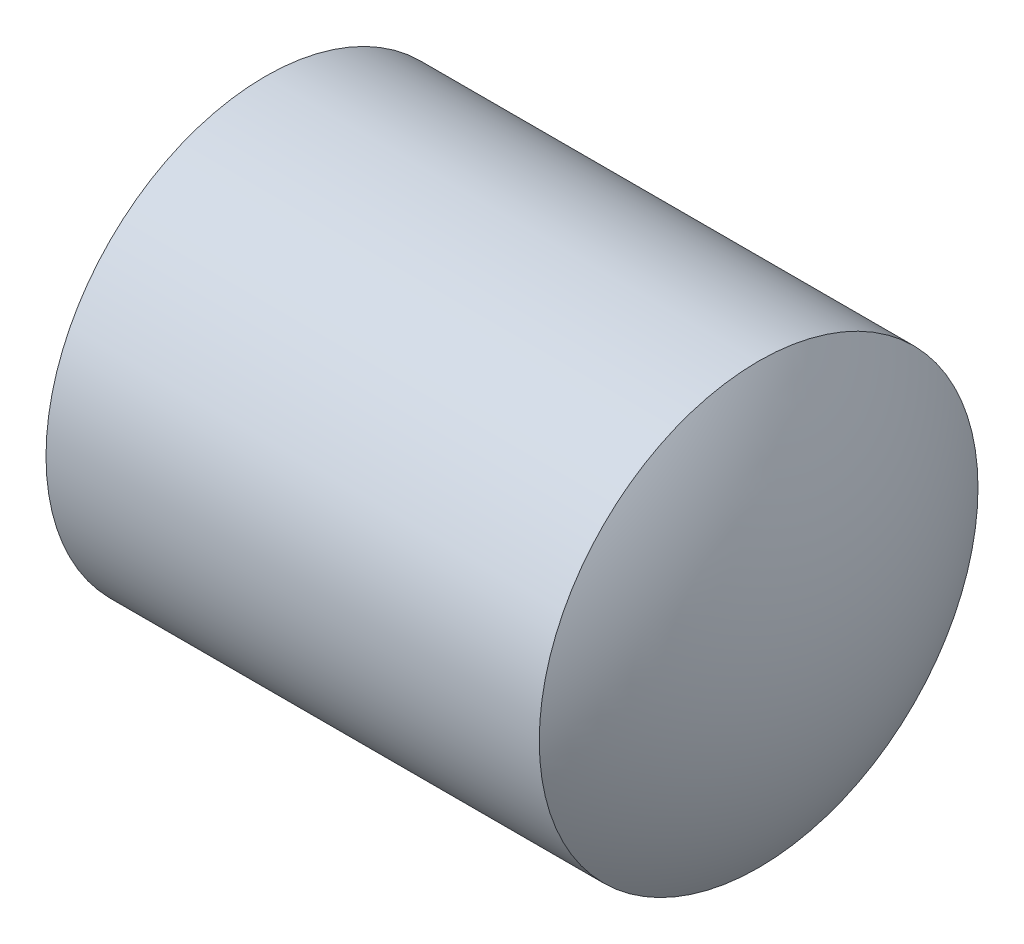
ISO-10303-21;
HEADER;
FILE_DESCRIPTION(('STEP AP214'),'2;1');
FILE_NAME('part.step','',(''),(''),'','','');
FILE_SCHEMA(('AUTOMOTIVE_DESIGN { 1 0 10303 214 1 1 1 1 }'));
ENDSEC;
DATA;
#1=APPLICATION_CONTEXT('core data for automotive mechanical design processes');
#2=APPLICATION_PROTOCOL_DEFINITION('international standard','automotive_design',2000,#1);
#3=PRODUCT_CONTEXT('',#1,'mechanical');
#4=PRODUCT('Part','Part','',(#3));
#5=PRODUCT_RELATED_PRODUCT_CATEGORY('part','',(#4));
#6=PRODUCT_DEFINITION_FORMATION('','',#4);
#7=PRODUCT_DEFINITION_CONTEXT('part definition',#1,'design');
#8=PRODUCT_DEFINITION('design','',#6,#7);
#9=PRODUCT_DEFINITION_SHAPE('','',#8);
#10=(LENGTH_UNIT() NAMED_UNIT(*) SI_UNIT(.MILLI.,.METRE.));
#11=(NAMED_UNIT(*) PLANE_ANGLE_UNIT() SI_UNIT($,.RADIAN.));
#12=(NAMED_UNIT(*) SI_UNIT($,.STERADIAN.) SOLID_ANGLE_UNIT());
#13=UNCERTAINTY_MEASURE_WITH_UNIT(LENGTH_MEASURE(1.E-05),#10,'distance_accuracy_value','');
#14=(GEOMETRIC_REPRESENTATION_CONTEXT(3) GLOBAL_UNCERTAINTY_ASSIGNED_CONTEXT((#13)) GLOBAL_UNIT_ASSIGNED_CONTEXT((#10,
#11,#12)) REPRESENTATION_CONTEXT('',''));
#15=CARTESIAN_POINT('',(0.,0.,0.));
#16=DIRECTION('',(0.,0.,1.));
#17=DIRECTION('',(1.,0.,0.));
#18=AXIS2_PLACEMENT_3D('',#15,#16,#17);
#19=CARTESIAN_POINT('',(0.,0.,0.));
#20=DIRECTION('',(-1.,0.,0.));
#21=DIRECTION('',(0.,0.,1.));
#22=AXIS2_PLACEMENT_3D('',#19,#20,#21);
#23=PLANE('',#22);
#24=CARTESIAN_POINT('',(0.,0.,0.));
#25=DIRECTION('',(-1.,0.,0.));
#26=DIRECTION('',(0.,0.,1.));
#27=AXIS2_PLACEMENT_3D('',#24,#25,#26);
#28=CIRCLE('',#27,1.2195);
#29=CARTESIAN_POINT('',(0.,0.,1.2195));
#30=VERTEX_POINT('',#29);
#31=EDGE_CURVE('E137',#30,#30,#28,.T.);
#32=ORIENTED_EDGE('',*,*,#31,.T.);
#33=EDGE_LOOP('',(#32));
#34=FACE_BOUND('',#33,.T.);
#35=DIRECTION('',(0.,0.,-1.));
#36=VECTOR('',#35,1.);
#37=CARTESIAN_POINT('',(0.,0.750000000000005,0.43301270189222));
#38=LINE('',#37,#36);
#39=CARTESIAN_POINT('',(0.,0.750000000000005,0.43301270189222));
#40=VERTEX_POINT('',#39);
#41=CARTESIAN_POINT('',(0.,0.750000000000005,-0.433012701892219));
#42=VERTEX_POINT('',#41);
#43=EDGE_CURVE('E128',#40,#42,#38,.T.);
#44=ORIENTED_EDGE('',*,*,#43,.F.);
#45=DIRECTION('',(0.,-0.866025403784438,0.5));
#46=VECTOR('',#45,1.);
#47=CARTESIAN_POINT('',(0.,0.750000000000005,0.43301270189222));
#48=LINE('',#47,#46);
#49=CARTESIAN_POINT('',(0.,0.,0.866025403784439));
#50=VERTEX_POINT('',#49);
#51=EDGE_CURVE('E50',#40,#50,#48,.T.);
#52=ORIENTED_EDGE('',*,*,#51,.T.);
#53=DIRECTION('',(0.,0.866025403784439,0.5));
#54=VECTOR('',#53,1.);
#55=CARTESIAN_POINT('',(0.,-0.749999999999995,0.43301270189222));
#56=LINE('',#55,#54);
#57=CARTESIAN_POINT('',(0.,-0.749999999999995,0.43301270189222));
#58=VERTEX_POINT('',#57);
#59=EDGE_CURVE('E119',#58,#50,#56,.T.);
#60=ORIENTED_EDGE('',*,*,#59,.F.);
#61=DIRECTION('',(0.,0.,-1.));
#62=VECTOR('',#61,1.);
#63=CARTESIAN_POINT('',(0.,-0.749999999999995,0.43301270189222));
#64=LINE('',#63,#62);
#65=CARTESIAN_POINT('',(0.,-0.749999999999995,-0.433012701892219));
#66=VERTEX_POINT('',#65);
#67=EDGE_CURVE('E122',#58,#66,#64,.T.);
#68=ORIENTED_EDGE('',*,*,#67,.T.);
#69=DIRECTION('',(0.,0.866025403784438,-0.500000000000001));
#70=VECTOR('',#69,1.);
#71=CARTESIAN_POINT('',(0.,-0.749999999999995,-0.433012701892219));
#72=LINE('',#71,#70);
#73=CARTESIAN_POINT('',(0.,0.,-0.866025403784438));
#74=VERTEX_POINT('',#73);
#75=EDGE_CURVE('E125',#66,#74,#72,.T.);
#76=ORIENTED_EDGE('',*,*,#75,.T.);
#77=DIRECTION('',(0.,-0.866025403784439,-0.5));
#78=VECTOR('',#77,1.);
#79=CARTESIAN_POINT('',(0.,0.750000000000005,-0.433012701892219));
#80=LINE('',#79,#78);
#81=EDGE_CURVE('E108',#42,#74,#80,.T.);
#82=ORIENTED_EDGE('',*,*,#81,.F.);
#83=EDGE_LOOP('',(#44,#52,#60,#68,#76,#82));
#84=FACE_BOUND('',#83,.T.);
#85=ADVANCED_FACE('F35',(#34,#84),#23,.T.);
#86=CARTESIAN_POINT('',(1.35,0.,0.));
#87=DIRECTION('',(-1.,0.,0.));
#88=DIRECTION('',(0.,1.,0.));
#89=AXIS2_PLACEMENT_3D('',#86,#87,#88);
#90=SPHERICAL_SURFACE('',#89,2.65);
#91=CARTESIAN_POINT('',(3.53460522749535,0.,0.));
#92=DIRECTION('',(-1.,0.,0.));
#93=DIRECTION('',(0.,0.,1.));
#94=AXIS2_PLACEMENT_3D('',#91,#92,#93);
#95=CIRCLE('',#94,1.5);
#96=CARTESIAN_POINT('',(3.53460522749535,0.,1.5));
#97=VERTEX_POINT('',#96);
#98=EDGE_CURVE('E11',#97,#97,#95,.T.);
#99=ORIENTED_EDGE('',*,*,#98,.F.);
#100=EDGE_LOOP('',(#99));
#101=FACE_BOUND('',#100,.T.);
#102=ADVANCED_FACE('F37',(#101),#90,.T.);
#103=CARTESIAN_POINT('',(-12.7,0.,0.));
#104=DIRECTION('',(-1.,0.,0.));
#105=DIRECTION('',(0.,0.,1.));
#106=AXIS2_PLACEMENT_3D('',#103,#104,#105);
#107=CYLINDRICAL_SURFACE('',#106,1.5);
#108=ORIENTED_EDGE('',*,*,#98,.T.);
#109=EDGE_LOOP('',(#108));
#110=FACE_BOUND('',#109,.T.);
#111=CARTESIAN_POINT('',(0.161946750507689,0.,0.));
#112=DIRECTION('',(-1.,0.,0.));
#113=DIRECTION('',(0.,0.,1.));
#114=AXIS2_PLACEMENT_3D('',#111,#112,#113);
#115=CIRCLE('',#114,1.5);
#116=CARTESIAN_POINT('',(0.161946750507689,0.,1.5));
#117=VERTEX_POINT('',#116);
#118=EDGE_CURVE('E43',#117,#117,#115,.T.);
#119=ORIENTED_EDGE('',*,*,#118,.F.);
#120=EDGE_LOOP('',(#119));
#121=FACE_BOUND('',#120,.T.);
#122=ADVANCED_FACE('F145',(#110,#121),#107,.T.);
#123=CARTESIAN_POINT('',(0.,0.,0.));
#124=DIRECTION('',(1.,0.,0.));
#125=DIRECTION('',(0.,0.,-1.));
#126=AXIS2_PLACEMENT_3D('',#123,#124,#125);
#127=CONICAL_SURFACE('',#126,1.2195,1.0471975511966);
#128=ORIENTED_EDGE('',*,*,#118,.T.);
#129=EDGE_LOOP('',(#128));
#130=FACE_BOUND('',#129,.T.);
#131=ORIENTED_EDGE('',*,*,#31,.F.);
#132=EDGE_LOOP('',(#131));
#133=FACE_BOUND('',#132,.T.);
#134=ADVANCED_FACE('F142',(#130,#133),#127,.T.);
#135=CARTESIAN_POINT('',(1.5,0.750000000000005,0.43301270189222));
#136=DIRECTION('',(0.,-0.500000000000001,-0.866025403784438));
#137=DIRECTION('',(0.,0.866025403784438,-0.500000000000001));
#138=AXIS2_PLACEMENT_3D('',#135,#136,#137);
#139=PLANE('',#138);
#140=ORIENTED_EDGE('',*,*,#51,.F.);
#141=DIRECTION('',(-1.,0.,0.));
#142=VECTOR('',#141,1.);
#143=CARTESIAN_POINT('',(1.5,0.750000000000005,0.43301270189222));
#144=LINE('',#143,#142);
#145=CARTESIAN_POINT('',(1.5,0.750000000000005,0.43301270189222));
#146=VERTEX_POINT('',#145);
#147=EDGE_CURVE('E55',#146,#40,#144,.T.);
#148=ORIENTED_EDGE('',*,*,#147,.F.);
#149=DIRECTION('',(0.,-0.866025403784438,0.5));
#150=VECTOR('',#149,1.);
#151=CARTESIAN_POINT('',(1.5,0.750000000000005,0.43301270189222));
#152=LINE('',#151,#150);
#153=CARTESIAN_POINT('',(1.5,0.,0.866025403784439));
#154=VERTEX_POINT('',#153);
#155=EDGE_CURVE('E82',#146,#154,#152,.T.);
#156=ORIENTED_EDGE('',*,*,#155,.T.);
#157=DIRECTION('',(-1.,0.,0.));
#158=VECTOR('',#157,1.);
#159=CARTESIAN_POINT('',(1.5,0.,0.866025403784439));
#160=LINE('',#159,#158);
#161=EDGE_CURVE('E135',#154,#50,#160,.T.);
#162=ORIENTED_EDGE('',*,*,#161,.T.);
#163=EDGE_LOOP('',(#140,#148,#156,#162));
#164=FACE_BOUND('',#163,.T.);
#165=ADVANCED_FACE('F152',(#164),#139,.T.);
#166=CARTESIAN_POINT('',(1.5,-0.749999999999995,0.43301270189222));
#167=DIRECTION('',(0.,-0.5,0.866025403784439));
#168=DIRECTION('',(0.,-0.866025403784439,-0.5));
#169=AXIS2_PLACEMENT_3D('',#166,#167,#168);
#170=PLANE('',#169);
#171=ORIENTED_EDGE('',*,*,#59,.T.);
#172=ORIENTED_EDGE('',*,*,#161,.F.);
#173=DIRECTION('',(0.,0.866025403784439,0.5));
#174=VECTOR('',#173,1.);
#175=CARTESIAN_POINT('',(1.5,-0.749999999999995,0.43301270189222));
#176=LINE('',#175,#174);
#177=CARTESIAN_POINT('',(1.5,-0.749999999999995,0.43301270189222));
#178=VERTEX_POINT('',#177);
#179=EDGE_CURVE('E250',#178,#154,#176,.T.);
#180=ORIENTED_EDGE('',*,*,#179,.F.);
#181=DIRECTION('',(-1.,0.,0.));
#182=VECTOR('',#181,1.);
#183=CARTESIAN_POINT('',(1.5,-0.749999999999995,0.43301270189222));
#184=LINE('',#183,#182);
#185=EDGE_CURVE('E133',#178,#58,#184,.T.);
#186=ORIENTED_EDGE('',*,*,#185,.T.);
#187=EDGE_LOOP('',(#171,#172,#180,#186));
#188=FACE_BOUND('',#187,.T.);
#189=ADVANCED_FACE('F164',(#188),#170,.F.);
#190=CARTESIAN_POINT('',(1.5,-0.749999999999995,0.43301270189222));
#191=DIRECTION('',(0.,1.,0.));
#192=DIRECTION('',(0.,0.,1.));
#193=AXIS2_PLACEMENT_3D('',#190,#191,#192);
#194=PLANE('',#193);
#195=ORIENTED_EDGE('',*,*,#67,.F.);
#196=ORIENTED_EDGE('',*,*,#185,.F.);
#197=DIRECTION('',(0.,0.,-1.));
#198=VECTOR('',#197,1.);
#199=CARTESIAN_POINT('',(1.5,-0.749999999999995,0.43301270189222));
#200=LINE('',#199,#198);
#201=CARTESIAN_POINT('',(1.5,-0.749999999999995,-0.433012701892219));
#202=VERTEX_POINT('',#201);
#203=EDGE_CURVE('E103',#178,#202,#200,.T.);
#204=ORIENTED_EDGE('',*,*,#203,.T.);
#205=DIRECTION('',(-1.,0.,0.));
#206=VECTOR('',#205,1.);
#207=CARTESIAN_POINT('',(1.5,-0.749999999999995,-0.433012701892219));
#208=LINE('',#207,#206);
#209=EDGE_CURVE('E98',#202,#66,#208,.T.);
#210=ORIENTED_EDGE('',*,*,#209,.T.);
#211=EDGE_LOOP('',(#195,#196,#204,#210));
#212=FACE_BOUND('',#211,.T.);
#213=ADVANCED_FACE('F167',(#212),#194,.T.);
#214=CARTESIAN_POINT('',(1.5,-0.749999999999995,-0.433012701892219));
#215=DIRECTION('',(0.,0.500000000000001,0.866025403784438));
#216=DIRECTION('',(0.,-0.866025403784438,0.500000000000001));
#217=AXIS2_PLACEMENT_3D('',#214,#215,#216);
#218=PLANE('',#217);
#219=ORIENTED_EDGE('',*,*,#75,.F.);
#220=ORIENTED_EDGE('',*,*,#209,.F.);
#221=DIRECTION('',(0.,0.866025403784438,-0.500000000000001));
#222=VECTOR('',#221,1.);
#223=CARTESIAN_POINT('',(1.5,-0.749999999999995,-0.433012701892219));
#224=LINE('',#223,#222);
#225=CARTESIAN_POINT('',(1.5,0.,-0.866025403784438));
#226=VERTEX_POINT('',#225);
#227=EDGE_CURVE('E93',#202,#226,#224,.T.);
#228=ORIENTED_EDGE('',*,*,#227,.T.);
#229=DIRECTION('',(-1.,0.,0.));
#230=VECTOR('',#229,1.);
#231=CARTESIAN_POINT('',(1.5,0.,-0.866025403784438));
#232=LINE('',#231,#230);
#233=EDGE_CURVE('E97',#226,#74,#232,.T.);
#234=ORIENTED_EDGE('',*,*,#233,.T.);
#235=EDGE_LOOP('',(#219,#220,#228,#234));
#236=FACE_BOUND('',#235,.T.);
#237=ADVANCED_FACE('F96',(#236),#218,.T.);
#238=CARTESIAN_POINT('',(1.5,0.750000000000005,-0.433012701892219));
#239=DIRECTION('',(0.,0.5,-0.866025403784438));
#240=DIRECTION('',(0.,0.866025403784439,0.5));
#241=AXIS2_PLACEMENT_3D('',#238,#239,#240);
#242=PLANE('',#241);
#243=ORIENTED_EDGE('',*,*,#81,.T.);
#244=ORIENTED_EDGE('',*,*,#233,.F.);
#245=DIRECTION('',(0.,-0.866025403784439,-0.5));
#246=VECTOR('',#245,1.);
#247=CARTESIAN_POINT('',(1.5,0.750000000000005,-0.433012701892219));
#248=LINE('',#247,#246);
#249=CARTESIAN_POINT('',(1.5,0.750000000000005,-0.433012701892219));
#250=VERTEX_POINT('',#249);
#251=EDGE_CURVE('E102',#250,#226,#248,.T.);
#252=ORIENTED_EDGE('',*,*,#251,.F.);
#253=DIRECTION('',(-1.,0.,0.));
#254=VECTOR('',#253,1.);
#255=CARTESIAN_POINT('',(1.5,0.750000000000005,-0.433012701892219));
#256=LINE('',#255,#254);
#257=EDGE_CURVE('E78',#250,#42,#256,.T.);
#258=ORIENTED_EDGE('',*,*,#257,.T.);
#259=EDGE_LOOP('',(#243,#244,#252,#258));
#260=FACE_BOUND('',#259,.T.);
#261=ADVANCED_FACE('F105',(#260),#242,.F.);
#262=CARTESIAN_POINT('',(1.5,0.750000000000005,0.43301270189222));
#263=DIRECTION('',(0.,1.,0.));
#264=DIRECTION('',(0.,0.,1.));
#265=AXIS2_PLACEMENT_3D('',#262,#263,#264);
#266=PLANE('',#265);
#267=ORIENTED_EDGE('',*,*,#43,.T.);
#268=ORIENTED_EDGE('',*,*,#257,.F.);
#269=DIRECTION('',(0.,0.,-1.));
#270=VECTOR('',#269,1.);
#271=CARTESIAN_POINT('',(1.5,0.750000000000005,0.43301270189222));
#272=LINE('',#271,#270);
#273=EDGE_CURVE('E113',#146,#250,#272,.T.);
#274=ORIENTED_EDGE('',*,*,#273,.F.);
#275=ORIENTED_EDGE('',*,*,#147,.T.);
#276=EDGE_LOOP('',(#267,#268,#274,#275));
#277=FACE_BOUND('',#276,.T.);
#278=ADVANCED_FACE('F176',(#277),#266,.F.);
#279=CARTESIAN_POINT('',(1.5,1.5,0.));
#280=DIRECTION('',(1.,0.,0.));
#281=DIRECTION('',(0.,0.,-1.));
#282=AXIS2_PLACEMENT_3D('',#279,#280,#281);
#283=PLANE('',#282);
#284=ORIENTED_EDGE('',*,*,#155,.F.);
#285=ORIENTED_EDGE('',*,*,#273,.T.);
#286=ORIENTED_EDGE('',*,*,#251,.T.);
#287=ORIENTED_EDGE('',*,*,#227,.F.);
#288=ORIENTED_EDGE('',*,*,#203,.F.);
#289=ORIENTED_EDGE('',*,*,#179,.T.);
#290=EDGE_LOOP('',(#284,#285,#286,#287,#288,#289));
#291=FACE_BOUND('',#290,.T.);
#292=ADVANCED_FACE('F111',(#291),#283,.F.);
#293=CLOSED_SHELL('',(#85,#102,#122,#134,#165,#189,#213,#237,#261,#278,#292));
#294=MANIFOLD_SOLID_BREP('B2',#293);
#295=ADVANCED_BREP_SHAPE_REPRESENTATION('',(#18,#294),#14);
#296=SHAPE_DEFINITION_REPRESENTATION(#9,#295);
ENDSEC;
END-ISO-10303-21;
